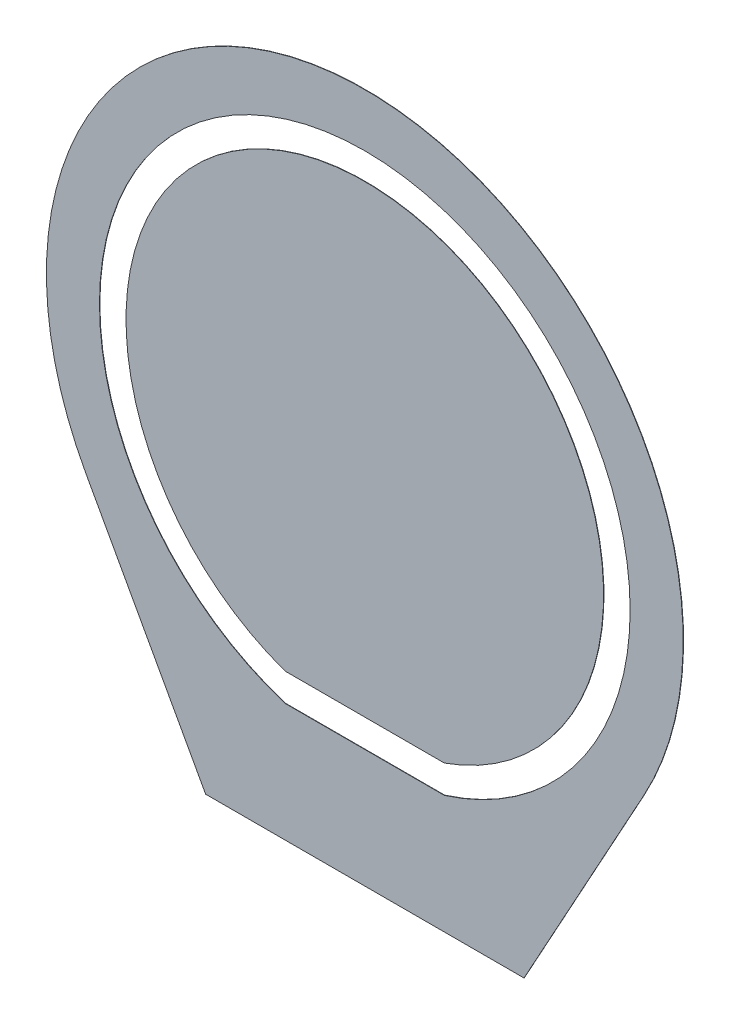
ISO-10303-21;
HEADER;
FILE_DESCRIPTION(('STEP AP214'),'2;1');
FILE_NAME('part.step','',(''),(''),'','','');
FILE_SCHEMA(('AUTOMOTIVE_DESIGN { 1 0 10303 214 1 1 1 1 }'));
ENDSEC;
DATA;
#1=APPLICATION_CONTEXT('core data for automotive mechanical design processes');
#2=APPLICATION_PROTOCOL_DEFINITION('international standard','automotive_design',2000,#1);
#3=PRODUCT_CONTEXT('',#1,'mechanical');
#4=PRODUCT('Part','Part','',(#3));
#5=PRODUCT_RELATED_PRODUCT_CATEGORY('part','',(#4));
#6=PRODUCT_DEFINITION_FORMATION('','',#4);
#7=PRODUCT_DEFINITION_CONTEXT('part definition',#1,'design');
#8=PRODUCT_DEFINITION('design','',#6,#7);
#9=PRODUCT_DEFINITION_SHAPE('','',#8);
#10=(LENGTH_UNIT() NAMED_UNIT(*) SI_UNIT(.MILLI.,.METRE.));
#11=(NAMED_UNIT(*) PLANE_ANGLE_UNIT() SI_UNIT($,.RADIAN.));
#12=(NAMED_UNIT(*) SI_UNIT($,.STERADIAN.) SOLID_ANGLE_UNIT());
#13=UNCERTAINTY_MEASURE_WITH_UNIT(LENGTH_MEASURE(1.E-05),#10,'distance_accuracy_value','');
#14=(GEOMETRIC_REPRESENTATION_CONTEXT(3) GLOBAL_UNCERTAINTY_ASSIGNED_CONTEXT((#13)) GLOBAL_UNIT_ASSIGNED_CONTEXT((#10,
#11,#12)) REPRESENTATION_CONTEXT('',''));
#15=CARTESIAN_POINT('',(0.,0.,0.));
#16=DIRECTION('',(0.,0.,1.));
#17=DIRECTION('',(1.,0.,0.));
#18=AXIS2_PLACEMENT_3D('',#15,#16,#17);
#19=CARTESIAN_POINT('',(0.,0.,0.03556));
#20=DIRECTION('',(0.,0.,-1.));
#21=DIRECTION('',(-1.,0.,0.));
#22=AXIS2_PLACEMENT_3D('',#19,#20,#21);
#23=CYLINDRICAL_SURFACE('',#22,25.);
#24=CARTESIAN_POINT('',(0.,0.,0.));
#25=DIRECTION('',(0.,0.,1.));
#26=DIRECTION('',(1.,0.,0.));
#27=AXIS2_PLACEMENT_3D('',#24,#25,#26);
#28=CIRCLE('',#27,25.);
#29=CARTESIAN_POINT('',(7.50000000442261,-23.8484800340328,0.));
#30=VERTEX_POINT('',#29);
#31=CARTESIAN_POINT('',(-7.50000000442261,-23.8484800340328,0.));
#32=VERTEX_POINT('',#31);
#33=EDGE_CURVE('E165',#30,#32,#28,.T.);
#34=ORIENTED_EDGE('',*,*,#33,.F.);
#35=DIRECTION('',(0.,0.,-1.));
#36=VECTOR('',#35,1.);
#37=CARTESIAN_POINT('',(7.50000000442261,-23.8484800340328,0.03556));
#38=LINE('',#37,#36);
#39=CARTESIAN_POINT('',(7.50000000442261,-23.8484800340328,0.03556));
#40=VERTEX_POINT('',#39);
#41=EDGE_CURVE('E13',#40,#30,#38,.T.);
#42=ORIENTED_EDGE('',*,*,#41,.F.);
#43=CARTESIAN_POINT('',(0.,0.,0.03556));
#44=DIRECTION('',(0.,0.,1.));
#45=DIRECTION('',(1.,0.,0.));
#46=AXIS2_PLACEMENT_3D('',#43,#44,#45);
#47=CIRCLE('',#46,25.);
#48=CARTESIAN_POINT('',(-7.50000000442261,-23.8484800340328,0.03556));
#49=VERTEX_POINT('',#48);
#50=EDGE_CURVE('E150',#40,#49,#47,.T.);
#51=ORIENTED_EDGE('',*,*,#50,.T.);
#52=DIRECTION('',(0.,0.,-1.));
#53=VECTOR('',#52,1.);
#54=CARTESIAN_POINT('',(-7.50000000442261,-23.8484800340328,0.03556));
#55=LINE('',#54,#53);
#56=EDGE_CURVE('E79',#49,#32,#55,.T.);
#57=ORIENTED_EDGE('',*,*,#56,.T.);
#58=EDGE_LOOP('',(#34,#42,#51,#57));
#59=FACE_BOUND('',#58,.T.);
#60=ADVANCED_FACE('F69',(#59),#23,.F.);
#61=CARTESIAN_POINT('',(0.,-35.0000000340328,0.03556));
#62=DIRECTION('',(0.,1.,0.));
#63=DIRECTION('',(-1.,0.,0.));
#64=AXIS2_PLACEMENT_3D('',#61,#62,#63);
#65=PLANE('',#64);
#66=DIRECTION('',(1.,0.,0.));
#67=VECTOR('',#66,1.);
#68=CARTESIAN_POINT('',(0.,-35.0000000340328,0.));
#69=LINE('',#68,#67);
#70=CARTESIAN_POINT('',(-15.,-35.0000000340328,0.));
#71=VERTEX_POINT('',#70);
#72=CARTESIAN_POINT('',(15.,-35.0000000340328,0.));
#73=VERTEX_POINT('',#72);
#74=EDGE_CURVE('E157',#71,#73,#69,.T.);
#75=ORIENTED_EDGE('',*,*,#74,.T.);
#76=DIRECTION('',(0.,0.,-1.));
#77=VECTOR('',#76,1.);
#78=CARTESIAN_POINT('',(15.,-35.0000000340328,0.03556));
#79=LINE('',#78,#77);
#80=CARTESIAN_POINT('',(15.,-35.0000000340328,0.03556));
#81=VERTEX_POINT('',#80);
#82=EDGE_CURVE('E73',#81,#73,#79,.T.);
#83=ORIENTED_EDGE('',*,*,#82,.F.);
#84=DIRECTION('',(1.,0.,0.));
#85=VECTOR('',#84,1.);
#86=CARTESIAN_POINT('',(0.,-35.0000000340328,0.03556));
#87=LINE('',#86,#85);
#88=CARTESIAN_POINT('',(-15.,-35.0000000340328,0.03556));
#89=VERTEX_POINT('',#88);
#90=EDGE_CURVE('E141',#89,#81,#87,.T.);
#91=ORIENTED_EDGE('',*,*,#90,.F.);
#92=DIRECTION('',(0.,0.,-1.));
#93=VECTOR('',#92,1.);
#94=CARTESIAN_POINT('',(-15.,-35.0000000340328,0.03556));
#95=LINE('',#94,#93);
#96=EDGE_CURVE('E127',#89,#71,#95,.T.);
#97=ORIENTED_EDGE('',*,*,#96,.T.);
#98=EDGE_LOOP('',(#75,#83,#91,#97));
#99=FACE_BOUND('',#98,.T.);
#100=ADVANCED_FACE('F71',(#99),#65,.F.);
#101=CARTESIAN_POINT('',(26.2928846577311,-14.4459065612114,0.03556));
#102=DIRECTION('',(-0.876429488591035,0.481530218707047,0.));
#103=DIRECTION('',(-0.481530218707047,-0.876429488591036,0.));
#104=AXIS2_PLACEMENT_3D('',#101,#102,#103);
#105=PLANE('',#104);
#106=DIRECTION('',(0.481530218707047,0.876429488591035,0.));
#107=VECTOR('',#106,1.);
#108=CARTESIAN_POINT('',(26.2928846577311,-14.4459065612114,0.));
#109=LINE('',#108,#107);
#110=CARTESIAN_POINT('',(26.2928846577311,-14.4459065612114,0.));
#111=VERTEX_POINT('',#110);
#112=EDGE_CURVE('E159',#73,#111,#109,.T.);
#113=ORIENTED_EDGE('',*,*,#112,.T.);
#114=DIRECTION('',(0.,0.,-1.));
#115=VECTOR('',#114,1.);
#116=CARTESIAN_POINT('',(26.2928846577311,-14.4459065612114,0.03556));
#117=LINE('',#116,#115);
#118=CARTESIAN_POINT('',(26.2928846577311,-14.4459065612114,0.03556));
#119=VERTEX_POINT('',#118);
#120=EDGE_CURVE('E170',#119,#111,#117,.T.);
#121=ORIENTED_EDGE('',*,*,#120,.F.);
#122=DIRECTION('',(0.481530218707047,0.876429488591035,0.));
#123=VECTOR('',#122,1.);
#124=CARTESIAN_POINT('',(26.2928846577311,-14.4459065612114,0.03556));
#125=LINE('',#124,#123);
#126=EDGE_CURVE('E117',#81,#119,#125,.T.);
#127=ORIENTED_EDGE('',*,*,#126,.F.);
#128=ORIENTED_EDGE('',*,*,#82,.T.);
#129=EDGE_LOOP('',(#113,#121,#127,#128));
#130=FACE_BOUND('',#129,.T.);
#131=ADVANCED_FACE('F174',(#130),#105,.F.);
#132=CARTESIAN_POINT('',(0.,0.,0.03556));
#133=DIRECTION('',(0.,0.,-1.));
#134=DIRECTION('',(-1.,0.,0.));
#135=AXIS2_PLACEMENT_3D('',#132,#133,#134);
#136=CYLINDRICAL_SURFACE('',#135,30.);
#137=CARTESIAN_POINT('',(0.,0.,0.));
#138=DIRECTION('',(0.,0.,1.));
#139=DIRECTION('',(1.,0.,0.));
#140=AXIS2_PLACEMENT_3D('',#137,#138,#139);
#141=CIRCLE('',#140,30.);
#142=CARTESIAN_POINT('',(-26.2928846577311,-14.4459065612114,0.));
#143=VERTEX_POINT('',#142);
#144=EDGE_CURVE('E161',#111,#143,#141,.T.);
#145=ORIENTED_EDGE('',*,*,#144,.T.);
#146=DIRECTION('',(0.,0.,-1.));
#147=VECTOR('',#146,1.);
#148=CARTESIAN_POINT('',(-26.2928846577311,-14.4459065612114,0.03556));
#149=LINE('',#148,#147);
#150=CARTESIAN_POINT('',(-26.2928846577311,-14.4459065612114,0.03556));
#151=VERTEX_POINT('',#150);
#152=EDGE_CURVE('E137',#151,#143,#149,.T.);
#153=ORIENTED_EDGE('',*,*,#152,.F.);
#154=CARTESIAN_POINT('',(0.,0.,0.03556));
#155=DIRECTION('',(0.,0.,1.));
#156=DIRECTION('',(1.,0.,0.));
#157=AXIS2_PLACEMENT_3D('',#154,#155,#156);
#158=CIRCLE('',#157,30.);
#159=EDGE_CURVE('E148',#119,#151,#158,.T.);
#160=ORIENTED_EDGE('',*,*,#159,.F.);
#161=ORIENTED_EDGE('',*,*,#120,.T.);
#162=EDGE_LOOP('',(#145,#153,#160,#161));
#163=FACE_BOUND('',#162,.T.);
#164=ADVANCED_FACE('F178',(#163),#136,.T.);
#165=CARTESIAN_POINT('',(-26.2928846577311,-14.4459065612114,0.03556));
#166=DIRECTION('',(-0.876429488591035,-0.481530218707047,0.));
#167=DIRECTION('',(0.481530218707047,-0.876429488591035,0.));
#168=AXIS2_PLACEMENT_3D('',#165,#166,#167);
#169=PLANE('',#168);
#170=DIRECTION('',(-0.481530218707047,0.876429488591035,0.));
#171=VECTOR('',#170,1.);
#172=CARTESIAN_POINT('',(-26.2928846577311,-14.4459065612114,0.));
#173=LINE('',#172,#171);
#174=EDGE_CURVE('E133',#71,#143,#173,.T.);
#175=ORIENTED_EDGE('',*,*,#174,.F.);
#176=ORIENTED_EDGE('',*,*,#96,.F.);
#177=DIRECTION('',(-0.481530218707047,0.876429488591035,0.));
#178=VECTOR('',#177,1.);
#179=CARTESIAN_POINT('',(-26.2928846577311,-14.4459065612114,0.03556));
#180=LINE('',#179,#178);
#181=EDGE_CURVE('E131',#89,#151,#180,.T.);
#182=ORIENTED_EDGE('',*,*,#181,.T.);
#183=ORIENTED_EDGE('',*,*,#152,.T.);
#184=EDGE_LOOP('',(#175,#176,#182,#183));
#185=FACE_BOUND('',#184,.T.);
#186=ADVANCED_FACE('F129',(#185),#169,.T.);
#187=CARTESIAN_POINT('',(0.,-23.8484800340328,0.03556));
#188=DIRECTION('',(0.,1.,0.));
#189=DIRECTION('',(0.,0.,1.));
#190=AXIS2_PLACEMENT_3D('',#187,#188,#189);
#191=PLANE('',#190);
#192=DIRECTION('',(1.,0.,0.));
#193=VECTOR('',#192,1.);
#194=CARTESIAN_POINT('',(0.,-23.8484800340328,0.));
#195=LINE('',#194,#193);
#196=EDGE_CURVE('E143',#32,#30,#195,.T.);
#197=ORIENTED_EDGE('',*,*,#196,.F.);
#198=ORIENTED_EDGE('',*,*,#56,.F.);
#199=DIRECTION('',(1.,0.,0.));
#200=VECTOR('',#199,1.);
#201=CARTESIAN_POINT('',(0.,-23.8484800340328,0.03556));
#202=LINE('',#201,#200);
#203=EDGE_CURVE('E138',#49,#40,#202,.T.);
#204=ORIENTED_EDGE('',*,*,#203,.T.);
#205=ORIENTED_EDGE('',*,*,#41,.T.);
#206=EDGE_LOOP('',(#197,#198,#204,#205));
#207=FACE_BOUND('',#206,.T.);
#208=ADVANCED_FACE('F185',(#207),#191,.T.);
#209=CARTESIAN_POINT('',(0.,0.,0.03556));
#210=DIRECTION('',(0.,0.,1.));
#211=DIRECTION('',(1.,0.,0.));
#212=AXIS2_PLACEMENT_3D('',#209,#210,#211);
#213=PLANE('',#212);
#214=ORIENTED_EDGE('',*,*,#90,.T.);
#215=ORIENTED_EDGE('',*,*,#126,.T.);
#216=ORIENTED_EDGE('',*,*,#159,.T.);
#217=ORIENTED_EDGE('',*,*,#181,.F.);
#218=EDGE_LOOP('',(#214,#215,#216,#217));
#219=FACE_BOUND('',#218,.T.);
#220=ORIENTED_EDGE('',*,*,#50,.F.);
#221=ORIENTED_EDGE('',*,*,#203,.F.);
#222=EDGE_LOOP('',(#220,#221));
#223=FACE_BOUND('',#222,.T.);
#224=ADVANCED_FACE('F145',(#219,#223),#213,.T.);
#225=CARTESIAN_POINT('',(0.,0.,0.));
#226=DIRECTION('',(0.,0.,1.));
#227=DIRECTION('',(1.,0.,0.));
#228=AXIS2_PLACEMENT_3D('',#225,#226,#227);
#229=PLANE('',#228);
#230=ORIENTED_EDGE('',*,*,#74,.F.);
#231=ORIENTED_EDGE('',*,*,#174,.T.);
#232=ORIENTED_EDGE('',*,*,#144,.F.);
#233=ORIENTED_EDGE('',*,*,#112,.F.);
#234=EDGE_LOOP('',(#230,#231,#232,#233));
#235=FACE_BOUND('',#234,.T.);
#236=ORIENTED_EDGE('',*,*,#33,.T.);
#237=ORIENTED_EDGE('',*,*,#196,.T.);
#238=EDGE_LOOP('',(#236,#237));
#239=FACE_BOUND('',#238,.T.);
#240=ADVANCED_FACE('F176',(#235,#239),#229,.F.);
#241=CLOSED_SHELL('',(#60,#100,#131,#164,#186,#208,#224,#240));
#242=MANIFOLD_SOLID_BREP('B2',#241);
#243=CARTESIAN_POINT('',(0.,-21.2132034340328,0.03556));
#244=DIRECTION('',(0.,1.,0.));
#245=DIRECTION('',(0.,0.,1.));
#246=AXIS2_PLACEMENT_3D('',#243,#244,#245);
#247=PLANE('',#246);
#248=DIRECTION('',(1.,0.,0.));
#249=VECTOR('',#248,1.);
#250=CARTESIAN_POINT('',(0.,-21.2132034340328,0.));
#251=LINE('',#250,#249);
#252=CARTESIAN_POINT('',(-7.50000000442261,-21.2132034340328,0.));
#253=VERTEX_POINT('',#252);
#254=CARTESIAN_POINT('',(7.50000000442261,-21.2132034340328,0.));
#255=VERTEX_POINT('',#254);
#256=EDGE_CURVE('E289',#253,#255,#251,.T.);
#257=ORIENTED_EDGE('',*,*,#256,.T.);
#258=DIRECTION('',(0.,0.,-1.));
#259=VECTOR('',#258,1.);
#260=CARTESIAN_POINT('',(7.50000000442261,-21.2132034340328,0.03556));
#261=LINE('',#260,#259);
#262=CARTESIAN_POINT('',(7.50000000442261,-21.2132034340328,0.03556));
#263=VERTEX_POINT('',#262);
#264=EDGE_CURVE('E67',#263,#255,#261,.T.);
#265=ORIENTED_EDGE('',*,*,#264,.F.);
#266=DIRECTION('',(1.,0.,0.));
#267=VECTOR('',#266,1.);
#268=CARTESIAN_POINT('',(0.,-21.2132034340328,0.03556));
#269=LINE('',#268,#267);
#270=CARTESIAN_POINT('',(-7.50000000442261,-21.2132034340328,0.03556));
#271=VERTEX_POINT('',#270);
#272=EDGE_CURVE('E288',#271,#263,#269,.T.);
#273=ORIENTED_EDGE('',*,*,#272,.F.);
#274=DIRECTION('',(0.,0.,-1.));
#275=VECTOR('',#274,1.);
#276=CARTESIAN_POINT('',(-7.50000000442261,-21.2132034340328,0.03556));
#277=LINE('',#276,#275);
#278=EDGE_CURVE('E265',#271,#253,#277,.T.);
#279=ORIENTED_EDGE('',*,*,#278,.T.);
#280=EDGE_LOOP('',(#257,#265,#273,#279));
#281=FACE_BOUND('',#280,.T.);
#282=ADVANCED_FACE('F256',(#281),#247,.F.);
#283=CARTESIAN_POINT('',(0.,0.,0.03556));
#284=DIRECTION('',(0.,0.,-1.));
#285=DIRECTION('',(-1.,0.,0.));
#286=AXIS2_PLACEMENT_3D('',#283,#284,#285);
#287=CYLINDRICAL_SURFACE('',#286,22.5);
#288=CARTESIAN_POINT('',(0.,0.,0.));
#289=DIRECTION('',(0.,0.,1.));
#290=DIRECTION('',(1.,0.,0.));
#291=AXIS2_PLACEMENT_3D('',#288,#289,#290);
#292=CIRCLE('',#291,22.5);
#293=EDGE_CURVE('E280',#255,#253,#292,.T.);
#294=ORIENTED_EDGE('',*,*,#293,.T.);
#295=ORIENTED_EDGE('',*,*,#278,.F.);
#296=CARTESIAN_POINT('',(0.,0.,0.03556));
#297=DIRECTION('',(0.,0.,1.));
#298=DIRECTION('',(1.,0.,0.));
#299=AXIS2_PLACEMENT_3D('',#296,#297,#298);
#300=CIRCLE('',#299,22.5);
#301=EDGE_CURVE('E272',#263,#271,#300,.T.);
#302=ORIENTED_EDGE('',*,*,#301,.F.);
#303=ORIENTED_EDGE('',*,*,#264,.T.);
#304=EDGE_LOOP('',(#294,#295,#302,#303));
#305=FACE_BOUND('',#304,.T.);
#306=ADVANCED_FACE('F283',(#305),#287,.T.);
#307=CARTESIAN_POINT('',(0.,0.,0.03556));
#308=DIRECTION('',(0.,0.,1.));
#309=DIRECTION('',(1.,0.,0.));
#310=AXIS2_PLACEMENT_3D('',#307,#308,#309);
#311=PLANE('',#310);
#312=ORIENTED_EDGE('',*,*,#272,.T.);
#313=ORIENTED_EDGE('',*,*,#301,.T.);
#314=EDGE_LOOP('',(#312,#313));
#315=FACE_BOUND('',#314,.T.);
#316=ADVANCED_FACE('F300',(#315),#311,.T.);
#317=CARTESIAN_POINT('',(0.,0.,0.));
#318=DIRECTION('',(0.,0.,1.));
#319=DIRECTION('',(1.,0.,0.));
#320=AXIS2_PLACEMENT_3D('',#317,#318,#319);
#321=PLANE('',#320);
#322=ORIENTED_EDGE('',*,*,#256,.F.);
#323=ORIENTED_EDGE('',*,*,#293,.F.);
#324=EDGE_LOOP('',(#322,#323));
#325=FACE_BOUND('',#324,.T.);
#326=ADVANCED_FACE('F293',(#325),#321,.F.);
#327=CLOSED_SHELL('',(#282,#306,#316,#326));
#328=MANIFOLD_SOLID_BREP('B7',#327);
#329=ADVANCED_BREP_SHAPE_REPRESENTATION('',(#18,#242,#328),#14);
#330=SHAPE_DEFINITION_REPRESENTATION(#9,#329);
ENDSEC;
END-ISO-10303-21;
